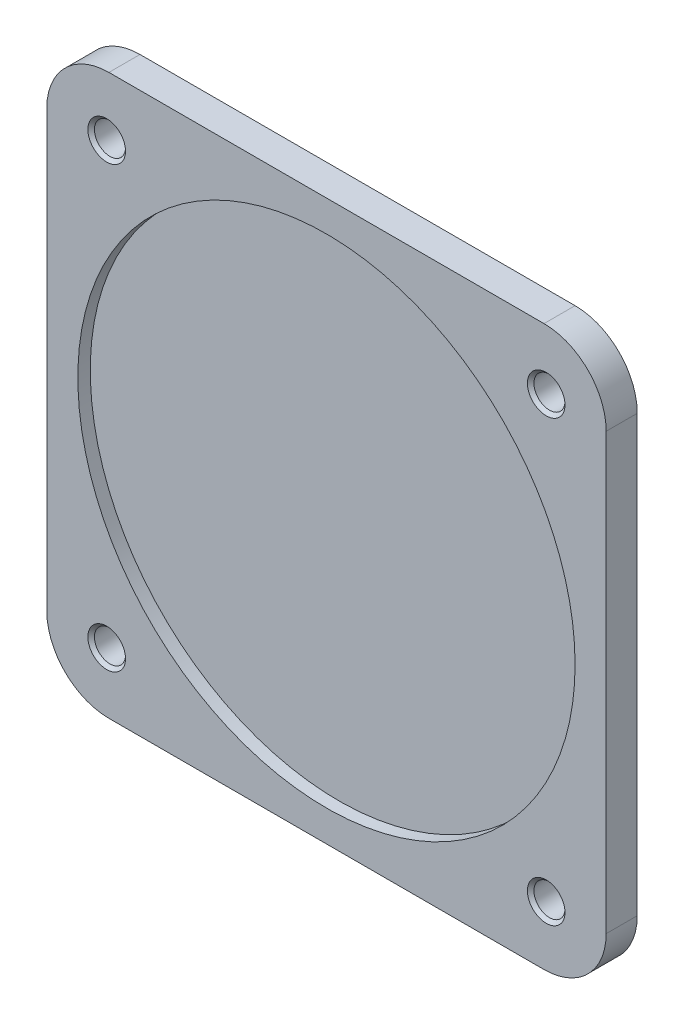
ISO-10303-21;
HEADER;
FILE_DESCRIPTION(('STEP AP214'),'2;1');
FILE_NAME('part.step','',(''),(''),'','','');
FILE_SCHEMA(('AUTOMOTIVE_DESIGN { 1 0 10303 214 1 1 1 1 }'));
ENDSEC;
DATA;
#1=APPLICATION_CONTEXT('core data for automotive mechanical design processes');
#2=APPLICATION_PROTOCOL_DEFINITION('international standard','automotive_design',2000,#1);
#3=PRODUCT_CONTEXT('',#1,'mechanical');
#4=PRODUCT('Part','Part','',(#3));
#5=PRODUCT_RELATED_PRODUCT_CATEGORY('part','',(#4));
#6=PRODUCT_DEFINITION_FORMATION('','',#4);
#7=PRODUCT_DEFINITION_CONTEXT('part definition',#1,'design');
#8=PRODUCT_DEFINITION('design','',#6,#7);
#9=PRODUCT_DEFINITION_SHAPE('','',#8);
#10=(LENGTH_UNIT() NAMED_UNIT(*) SI_UNIT(.MILLI.,.METRE.));
#11=(NAMED_UNIT(*) PLANE_ANGLE_UNIT() SI_UNIT($,.RADIAN.));
#12=(NAMED_UNIT(*) SI_UNIT($,.STERADIAN.) SOLID_ANGLE_UNIT());
#13=UNCERTAINTY_MEASURE_WITH_UNIT(LENGTH_MEASURE(1.E-05),#10,'distance_accuracy_value','');
#14=(GEOMETRIC_REPRESENTATION_CONTEXT(3) GLOBAL_UNCERTAINTY_ASSIGNED_CONTEXT((#13)) GLOBAL_UNIT_ASSIGNED_CONTEXT((#10,
#11,#12)) REPRESENTATION_CONTEXT('',''));
#15=CARTESIAN_POINT('',(0.,0.,0.));
#16=DIRECTION('',(0.,0.,1.));
#17=DIRECTION('',(1.,0.,0.));
#18=AXIS2_PLACEMENT_3D('',#15,#16,#17);
#19=CARTESIAN_POINT('',(45.,45.,5.));
#20=DIRECTION('',(-1.,0.,0.));
#21=DIRECTION('',(0.,-1.,0.));
#22=AXIS2_PLACEMENT_3D('',#19,#20,#21);
#23=PLANE('',#22);
#24=DIRECTION('',(0.,1.,0.));
#25=VECTOR('',#24,1.);
#26=CARTESIAN_POINT('',(45.,45.,5.));
#27=LINE('',#26,#25);
#28=CARTESIAN_POINT('',(45.,-35.,5.));
#29=VERTEX_POINT('',#28);
#30=CARTESIAN_POINT('',(45.,35.,5.));
#31=VERTEX_POINT('',#30);
#32=EDGE_CURVE('E129',#29,#31,#27,.T.);
#33=ORIENTED_EDGE('',*,*,#32,.F.);
#34=DIRECTION('',(0.,0.,-1.));
#35=VECTOR('',#34,1.);
#36=CARTESIAN_POINT('',(45.,-35.,5.));
#37=LINE('',#36,#35);
#38=CARTESIAN_POINT('',(45.,-35.,0.));
#39=VERTEX_POINT('',#38);
#40=EDGE_CURVE('E114',#29,#39,#37,.T.);
#41=ORIENTED_EDGE('',*,*,#40,.T.);
#42=DIRECTION('',(0.,1.,0.));
#43=VECTOR('',#42,1.);
#44=CARTESIAN_POINT('',(45.,45.,0.));
#45=LINE('',#44,#43);
#46=CARTESIAN_POINT('',(45.,35.,0.));
#47=VERTEX_POINT('',#46);
#48=EDGE_CURVE('E126',#39,#47,#45,.T.);
#49=ORIENTED_EDGE('',*,*,#48,.T.);
#50=DIRECTION('',(0.,0.,-1.));
#51=VECTOR('',#50,1.);
#52=CARTESIAN_POINT('',(45.,35.,5.));
#53=LINE('',#52,#51);
#54=EDGE_CURVE('E131',#47,#31,#53,.F.);
#55=ORIENTED_EDGE('',*,*,#54,.T.);
#56=EDGE_LOOP('',(#33,#41,#49,#55));
#57=FACE_BOUND('',#56,.T.);
#58=ADVANCED_FACE('F41',(#57),#23,.F.);
#59=CARTESIAN_POINT('',(-45.,45.,5.));
#60=DIRECTION('',(0.,-1.,0.));
#61=DIRECTION('',(0.,0.,-1.));
#62=AXIS2_PLACEMENT_3D('',#59,#60,#61);
#63=PLANE('',#62);
#64=DIRECTION('',(-1.,0.,0.));
#65=VECTOR('',#64,1.);
#66=CARTESIAN_POINT('',(-45.,45.,5.));
#67=LINE('',#66,#65);
#68=CARTESIAN_POINT('',(35.,45.,5.));
#69=VERTEX_POINT('',#68);
#70=CARTESIAN_POINT('',(-35.,45.,5.));
#71=VERTEX_POINT('',#70);
#72=EDGE_CURVE('E199',#69,#71,#67,.T.);
#73=ORIENTED_EDGE('',*,*,#72,.F.);
#74=DIRECTION('',(0.,0.,-1.));
#75=VECTOR('',#74,1.);
#76=CARTESIAN_POINT('',(35.,45.,5.));
#77=LINE('',#76,#75);
#78=CARTESIAN_POINT('',(35.,45.,0.));
#79=VERTEX_POINT('',#78);
#80=EDGE_CURVE('E11',#69,#79,#77,.T.);
#81=ORIENTED_EDGE('',*,*,#80,.T.);
#82=DIRECTION('',(-1.,0.,0.));
#83=VECTOR('',#82,1.);
#84=CARTESIAN_POINT('',(-45.,45.,0.));
#85=LINE('',#84,#83);
#86=CARTESIAN_POINT('',(-35.,45.,0.));
#87=VERTEX_POINT('',#86);
#88=EDGE_CURVE('E136',#79,#87,#85,.T.);
#89=ORIENTED_EDGE('',*,*,#88,.T.);
#90=DIRECTION('',(0.,0.,-1.));
#91=VECTOR('',#90,1.);
#92=CARTESIAN_POINT('',(-35.,45.,5.));
#93=LINE('',#92,#91);
#94=EDGE_CURVE('E50',#87,#71,#93,.F.);
#95=ORIENTED_EDGE('',*,*,#94,.T.);
#96=EDGE_LOOP('',(#73,#81,#89,#95));
#97=FACE_BOUND('',#96,.T.);
#98=ADVANCED_FACE('F217',(#97),#63,.F.);
#99=CARTESIAN_POINT('',(-45.,45.,5.));
#100=DIRECTION('',(1.,0.,0.));
#101=DIRECTION('',(0.,1.,0.));
#102=AXIS2_PLACEMENT_3D('',#99,#100,#101);
#103=PLANE('',#102);
#104=DIRECTION('',(0.,-1.,0.));
#105=VECTOR('',#104,1.);
#106=CARTESIAN_POINT('',(-45.,45.,0.));
#107=LINE('',#106,#105);
#108=CARTESIAN_POINT('',(-45.,35.,0.));
#109=VERTEX_POINT('',#108);
#110=CARTESIAN_POINT('',(-45.,-35.,0.));
#111=VERTEX_POINT('',#110);
#112=EDGE_CURVE('E140',#109,#111,#107,.T.);
#113=ORIENTED_EDGE('',*,*,#112,.T.);
#114=DIRECTION('',(0.,0.,-1.));
#115=VECTOR('',#114,1.);
#116=CARTESIAN_POINT('',(-45.,-35.,5.));
#117=LINE('',#116,#115);
#118=CARTESIAN_POINT('',(-45.,-35.,5.));
#119=VERTEX_POINT('',#118);
#120=EDGE_CURVE('E58',#111,#119,#117,.F.);
#121=ORIENTED_EDGE('',*,*,#120,.T.);
#122=DIRECTION('',(0.,-1.,0.));
#123=VECTOR('',#122,1.);
#124=CARTESIAN_POINT('',(-45.,45.,5.));
#125=LINE('',#124,#123);
#126=CARTESIAN_POINT('',(-45.,35.,5.));
#127=VERTEX_POINT('',#126);
#128=EDGE_CURVE('E200',#127,#119,#125,.T.);
#129=ORIENTED_EDGE('',*,*,#128,.F.);
#130=DIRECTION('',(0.,0.,-1.));
#131=VECTOR('',#130,1.);
#132=CARTESIAN_POINT('',(-45.,35.,5.));
#133=LINE('',#132,#131);
#134=EDGE_CURVE('E166',#127,#109,#133,.T.);
#135=ORIENTED_EDGE('',*,*,#134,.T.);
#136=EDGE_LOOP('',(#113,#121,#129,#135));
#137=FACE_BOUND('',#136,.T.);
#138=ADVANCED_FACE('F211',(#137),#103,.F.);
#139=CARTESIAN_POINT('',(-45.,-45.,5.));
#140=DIRECTION('',(0.,1.,0.));
#141=DIRECTION('',(0.,0.,1.));
#142=AXIS2_PLACEMENT_3D('',#139,#140,#141);
#143=PLANE('',#142);
#144=DIRECTION('',(1.,0.,0.));
#145=VECTOR('',#144,1.);
#146=CARTESIAN_POINT('',(-45.,-45.,0.));
#147=LINE('',#146,#145);
#148=CARTESIAN_POINT('',(-35.,-45.,0.));
#149=VERTEX_POINT('',#148);
#150=CARTESIAN_POINT('',(35.,-45.,0.));
#151=VERTEX_POINT('',#150);
#152=EDGE_CURVE('E150',#149,#151,#147,.T.);
#153=ORIENTED_EDGE('',*,*,#152,.T.);
#154=DIRECTION('',(0.,0.,-1.));
#155=VECTOR('',#154,1.);
#156=CARTESIAN_POINT('',(35.,-45.,5.));
#157=LINE('',#156,#155);
#158=CARTESIAN_POINT('',(35.,-45.,5.));
#159=VERTEX_POINT('',#158);
#160=EDGE_CURVE('E115',#151,#159,#157,.F.);
#161=ORIENTED_EDGE('',*,*,#160,.T.);
#162=DIRECTION('',(1.,0.,0.));
#163=VECTOR('',#162,1.);
#164=CARTESIAN_POINT('',(-45.,-45.,5.));
#165=LINE('',#164,#163);
#166=CARTESIAN_POINT('',(-35.,-45.,5.));
#167=VERTEX_POINT('',#166);
#168=EDGE_CURVE('E146',#167,#159,#165,.T.);
#169=ORIENTED_EDGE('',*,*,#168,.F.);
#170=DIRECTION('',(0.,0.,-1.));
#171=VECTOR('',#170,1.);
#172=CARTESIAN_POINT('',(-35.,-45.,5.));
#173=LINE('',#172,#171);
#174=EDGE_CURVE('E120',#167,#149,#173,.T.);
#175=ORIENTED_EDGE('',*,*,#174,.T.);
#176=EDGE_LOOP('',(#153,#161,#169,#175));
#177=FACE_BOUND('',#176,.T.);
#178=ADVANCED_FACE('F207',(#177),#143,.F.);
#179=CARTESIAN_POINT('',(0.,0.,5.));
#180=DIRECTION('',(0.,0.,1.));
#181=DIRECTION('',(1.,0.,0.));
#182=AXIS2_PLACEMENT_3D('',#179,#180,#181);
#183=PLANE('',#182);
#184=CARTESIAN_POINT('',(0.,0.,5.));
#185=DIRECTION('',(0.,0.,1.));
#186=DIRECTION('',(1.,0.,0.));
#187=AXIS2_PLACEMENT_3D('',#184,#185,#186);
#188=CIRCLE('',#187,40.);
#189=CARTESIAN_POINT('',(40.,0.,5.));
#190=VERTEX_POINT('',#189);
#191=EDGE_CURVE('E401',#190,#190,#188,.T.);
#192=ORIENTED_EDGE('',*,*,#191,.F.);
#193=EDGE_LOOP('',(#192));
#194=FACE_BOUND('',#193,.T.);
#195=CARTESIAN_POINT('',(-35.3553390593273,35.3553390593274,5.));
#196=DIRECTION('',(0.,0.,1.));
#197=DIRECTION('',(1.,0.,0.));
#198=AXIS2_PLACEMENT_3D('',#195,#196,#197);
#199=CIRCLE('',#198,3.025);
#200=CARTESIAN_POINT('',(-32.3303390593273,35.3553390593274,5.));
#201=VERTEX_POINT('',#200);
#202=EDGE_CURVE('E400',#201,#201,#199,.T.);
#203=ORIENTED_EDGE('',*,*,#202,.F.);
#204=EDGE_LOOP('',(#203));
#205=FACE_BOUND('',#204,.T.);
#206=CARTESIAN_POINT('',(35.3553390593274,35.3553390593274,5.));
#207=DIRECTION('',(0.,0.,1.));
#208=DIRECTION('',(1.,0.,0.));
#209=AXIS2_PLACEMENT_3D('',#206,#207,#208);
#210=CIRCLE('',#209,3.025);
#211=CARTESIAN_POINT('',(38.3803390593274,35.3553390593274,5.));
#212=VERTEX_POINT('',#211);
#213=EDGE_CURVE('E184',#212,#212,#210,.T.);
#214=ORIENTED_EDGE('',*,*,#213,.F.);
#215=EDGE_LOOP('',(#214));
#216=FACE_BOUND('',#215,.T.);
#217=CARTESIAN_POINT('',(-35.3553390593272,-35.3553390593275,5.));
#218=DIRECTION('',(0.,0.,1.));
#219=DIRECTION('',(1.,0.,0.));
#220=AXIS2_PLACEMENT_3D('',#217,#218,#219);
#221=CIRCLE('',#220,3.025);
#222=CARTESIAN_POINT('',(-32.3303390593272,-35.3553390593275,5.));
#223=VERTEX_POINT('',#222);
#224=EDGE_CURVE('E177',#223,#223,#221,.T.);
#225=ORIENTED_EDGE('',*,*,#224,.F.);
#226=EDGE_LOOP('',(#225));
#227=FACE_BOUND('',#226,.T.);
#228=CARTESIAN_POINT('',(35.3553390593274,-35.3553390593274,5.));
#229=DIRECTION('',(0.,0.,1.));
#230=DIRECTION('',(1.,0.,0.));
#231=AXIS2_PLACEMENT_3D('',#228,#229,#230);
#232=CIRCLE('',#231,3.025);
#233=CARTESIAN_POINT('',(38.3803390593274,-35.3553390593274,5.));
#234=VERTEX_POINT('',#233);
#235=EDGE_CURVE('E173',#234,#234,#232,.T.);
#236=ORIENTED_EDGE('',*,*,#235,.F.);
#237=EDGE_LOOP('',(#236));
#238=FACE_BOUND('',#237,.T.);
#239=ORIENTED_EDGE('',*,*,#168,.T.);
#240=CARTESIAN_POINT('',(35.,-35.,5.));
#241=DIRECTION('',(0.,0.,1.));
#242=DIRECTION('',(1.,0.,0.));
#243=AXIS2_PLACEMENT_3D('',#240,#241,#242);
#244=CIRCLE('',#243,10.);
#245=EDGE_CURVE('E164',#159,#29,#244,.T.);
#246=ORIENTED_EDGE('',*,*,#245,.T.);
#247=ORIENTED_EDGE('',*,*,#32,.T.);
#248=CARTESIAN_POINT('',(35.,35.,5.));
#249=DIRECTION('',(0.,0.,1.));
#250=DIRECTION('',(1.,0.,0.));
#251=AXIS2_PLACEMENT_3D('',#248,#249,#250);
#252=CIRCLE('',#251,10.);
#253=EDGE_CURVE('E160',#31,#69,#252,.T.);
#254=ORIENTED_EDGE('',*,*,#253,.T.);
#255=ORIENTED_EDGE('',*,*,#72,.T.);
#256=CARTESIAN_POINT('',(-35.,35.,5.));
#257=DIRECTION('',(0.,0.,1.));
#258=DIRECTION('',(1.,0.,0.));
#259=AXIS2_PLACEMENT_3D('',#256,#257,#258);
#260=CIRCLE('',#259,10.);
#261=EDGE_CURVE('E65',#71,#127,#260,.T.);
#262=ORIENTED_EDGE('',*,*,#261,.T.);
#263=ORIENTED_EDGE('',*,*,#128,.T.);
#264=CARTESIAN_POINT('',(-35.,-35.,5.));
#265=DIRECTION('',(0.,0.,1.));
#266=DIRECTION('',(1.,0.,0.));
#267=AXIS2_PLACEMENT_3D('',#264,#265,#266);
#268=CIRCLE('',#267,10.);
#269=EDGE_CURVE('E162',#119,#167,#268,.T.);
#270=ORIENTED_EDGE('',*,*,#269,.T.);
#271=EDGE_LOOP('',(#239,#246,#247,#254,#255,#262,#263,#270));
#272=FACE_BOUND('',#271,.T.);
#273=ADVANCED_FACE('F204',(#194,#205,#216,#227,#238,#272),#183,.T.);
#274=CARTESIAN_POINT('',(0.,0.,0.));
#275=DIRECTION('',(0.,0.,1.));
#276=DIRECTION('',(1.,0.,0.));
#277=AXIS2_PLACEMENT_3D('',#274,#275,#276);
#278=PLANE('',#277);
#279=CARTESIAN_POINT('',(-35.3553390593273,35.3553390593274,0.));
#280=DIRECTION('',(0.,0.,1.));
#281=DIRECTION('',(1.,0.,0.));
#282=AXIS2_PLACEMENT_3D('',#279,#280,#281);
#283=CIRCLE('',#282,2.49999999999999);
#284=CARTESIAN_POINT('',(-32.8553390593273,35.3553390593274,0.));
#285=VERTEX_POINT('',#284);
#286=EDGE_CURVE('E45',#285,#285,#283,.T.);
#287=ORIENTED_EDGE('',*,*,#286,.T.);
#288=EDGE_LOOP('',(#287));
#289=FACE_BOUND('',#288,.T.);
#290=CARTESIAN_POINT('',(35.3553390593274,35.3553390593274,0.));
#291=DIRECTION('',(0.,0.,1.));
#292=DIRECTION('',(1.,0.,0.));
#293=AXIS2_PLACEMENT_3D('',#290,#291,#292);
#294=CIRCLE('',#293,2.49999999999999);
#295=CARTESIAN_POINT('',(37.8553390593273,35.3553390593274,0.));
#296=VERTEX_POINT('',#295);
#297=EDGE_CURVE('E175',#296,#296,#294,.T.);
#298=ORIENTED_EDGE('',*,*,#297,.T.);
#299=EDGE_LOOP('',(#298));
#300=FACE_BOUND('',#299,.T.);
#301=CARTESIAN_POINT('',(-35.3553390593272,-35.3553390593275,0.));
#302=DIRECTION('',(0.,0.,1.));
#303=DIRECTION('',(1.,0.,0.));
#304=AXIS2_PLACEMENT_3D('',#301,#302,#303);
#305=CIRCLE('',#304,2.49999999999999);
#306=CARTESIAN_POINT('',(-32.8553390593273,-35.3553390593275,0.));
#307=VERTEX_POINT('',#306);
#308=EDGE_CURVE('E171',#307,#307,#305,.T.);
#309=ORIENTED_EDGE('',*,*,#308,.T.);
#310=EDGE_LOOP('',(#309));
#311=FACE_BOUND('',#310,.T.);
#312=CARTESIAN_POINT('',(35.3553390593274,-35.3553390593274,0.));
#313=DIRECTION('',(0.,0.,1.));
#314=DIRECTION('',(1.,0.,0.));
#315=AXIS2_PLACEMENT_3D('',#312,#313,#314);
#316=CIRCLE('',#315,2.49999999999999);
#317=CARTESIAN_POINT('',(37.8553390593274,-35.3553390593274,0.));
#318=VERTEX_POINT('',#317);
#319=EDGE_CURVE('E137',#318,#318,#316,.T.);
#320=ORIENTED_EDGE('',*,*,#319,.T.);
#321=EDGE_LOOP('',(#320));
#322=FACE_BOUND('',#321,.T.);
#323=ORIENTED_EDGE('',*,*,#48,.F.);
#324=CARTESIAN_POINT('',(35.,-35.,0.));
#325=DIRECTION('',(0.,0.,1.));
#326=DIRECTION('',(1.,0.,0.));
#327=AXIS2_PLACEMENT_3D('',#324,#325,#326);
#328=CIRCLE('',#327,10.);
#329=EDGE_CURVE('E110',#39,#151,#328,.F.);
#330=ORIENTED_EDGE('',*,*,#329,.T.);
#331=ORIENTED_EDGE('',*,*,#152,.F.);
#332=CARTESIAN_POINT('',(-35.,-35.,0.));
#333=DIRECTION('',(0.,0.,1.));
#334=DIRECTION('',(1.,0.,0.));
#335=AXIS2_PLACEMENT_3D('',#332,#333,#334);
#336=CIRCLE('',#335,10.);
#337=EDGE_CURVE('E121',#149,#111,#336,.F.);
#338=ORIENTED_EDGE('',*,*,#337,.T.);
#339=ORIENTED_EDGE('',*,*,#112,.F.);
#340=CARTESIAN_POINT('',(-35.,35.,0.));
#341=DIRECTION('',(0.,0.,1.));
#342=DIRECTION('',(1.,0.,0.));
#343=AXIS2_PLACEMENT_3D('',#340,#341,#342);
#344=CIRCLE('',#343,10.);
#345=EDGE_CURVE('E130',#109,#87,#344,.F.);
#346=ORIENTED_EDGE('',*,*,#345,.T.);
#347=ORIENTED_EDGE('',*,*,#88,.F.);
#348=CARTESIAN_POINT('',(35.,35.,0.));
#349=DIRECTION('',(0.,0.,1.));
#350=DIRECTION('',(1.,0.,0.));
#351=AXIS2_PLACEMENT_3D('',#348,#349,#350);
#352=CIRCLE('',#351,10.);
#353=EDGE_CURVE('E135',#79,#47,#352,.F.);
#354=ORIENTED_EDGE('',*,*,#353,.T.);
#355=EDGE_LOOP('',(#323,#330,#331,#338,#339,#346,#347,#354));
#356=FACE_BOUND('',#355,.T.);
#357=ADVANCED_FACE('F133',(#289,#300,#311,#322,#356),#278,.F.);
#358=CARTESIAN_POINT('',(35.,-35.,5.));
#359=DIRECTION('',(0.,0.,-1.));
#360=DIRECTION('',(-1.,0.,0.));
#361=AXIS2_PLACEMENT_3D('',#358,#359,#360);
#362=CYLINDRICAL_SURFACE('',#361,10.);
#363=ORIENTED_EDGE('',*,*,#245,.F.);
#364=ORIENTED_EDGE('',*,*,#160,.F.);
#365=ORIENTED_EDGE('',*,*,#329,.F.);
#366=ORIENTED_EDGE('',*,*,#40,.F.);
#367=EDGE_LOOP('',(#363,#364,#365,#366));
#368=FACE_BOUND('',#367,.T.);
#369=ADVANCED_FACE('F113',(#368),#362,.T.);
#370=CARTESIAN_POINT('',(-35.,-35.,5.));
#371=DIRECTION('',(0.,0.,-1.));
#372=DIRECTION('',(-1.,0.,0.));
#373=AXIS2_PLACEMENT_3D('',#370,#371,#372);
#374=CYLINDRICAL_SURFACE('',#373,10.);
#375=ORIENTED_EDGE('',*,*,#269,.F.);
#376=ORIENTED_EDGE('',*,*,#120,.F.);
#377=ORIENTED_EDGE('',*,*,#337,.F.);
#378=ORIENTED_EDGE('',*,*,#174,.F.);
#379=EDGE_LOOP('',(#375,#376,#377,#378));
#380=FACE_BOUND('',#379,.T.);
#381=ADVANCED_FACE('F209',(#380),#374,.T.);
#382=CARTESIAN_POINT('',(35.,35.,5.));
#383=DIRECTION('',(0.,0.,-1.));
#384=DIRECTION('',(-1.,0.,0.));
#385=AXIS2_PLACEMENT_3D('',#382,#383,#384);
#386=CYLINDRICAL_SURFACE('',#385,10.);
#387=ORIENTED_EDGE('',*,*,#253,.F.);
#388=ORIENTED_EDGE('',*,*,#54,.F.);
#389=ORIENTED_EDGE('',*,*,#353,.F.);
#390=ORIENTED_EDGE('',*,*,#80,.F.);
#391=EDGE_LOOP('',(#387,#388,#389,#390));
#392=FACE_BOUND('',#391,.T.);
#393=ADVANCED_FACE('F221',(#392),#386,.T.);
#394=CARTESIAN_POINT('',(-35.,35.,5.));
#395=DIRECTION('',(0.,0.,-1.));
#396=DIRECTION('',(-1.,0.,0.));
#397=AXIS2_PLACEMENT_3D('',#394,#395,#396);
#398=CYLINDRICAL_SURFACE('',#397,10.);
#399=ORIENTED_EDGE('',*,*,#261,.F.);
#400=ORIENTED_EDGE('',*,*,#94,.F.);
#401=ORIENTED_EDGE('',*,*,#345,.F.);
#402=ORIENTED_EDGE('',*,*,#134,.F.);
#403=EDGE_LOOP('',(#399,#400,#401,#402));
#404=FACE_BOUND('',#403,.T.);
#405=ADVANCED_FACE('F43',(#404),#398,.T.);
#406=CARTESIAN_POINT('',(35.3553390593274,-35.3553390593274,5.));
#407=DIRECTION('',(0.,0.,1.));
#408=DIRECTION('',(1.,0.,0.));
#409=AXIS2_PLACEMENT_3D('',#406,#407,#408);
#410=CYLINDRICAL_SURFACE('',#409,2.49999999999999);
#411=CARTESIAN_POINT('',(35.3553390593274,-35.3553390593274,4.47499999999999));
#412=DIRECTION('',(0.,0.,1.));
#413=DIRECTION('',(1.,0.,0.));
#414=AXIS2_PLACEMENT_3D('',#411,#412,#413);
#415=CIRCLE('',#414,2.49999999999999);
#416=CARTESIAN_POINT('',(37.8553390593274,-35.3553390593274,4.47499999999999));
#417=VERTEX_POINT('',#416);
#418=EDGE_CURVE('E143',#417,#417,#415,.T.);
#419=ORIENTED_EDGE('',*,*,#418,.T.);
#420=EDGE_LOOP('',(#419));
#421=FACE_BOUND('',#420,.T.);
#422=ORIENTED_EDGE('',*,*,#319,.F.);
#423=EDGE_LOOP('',(#422));
#424=FACE_BOUND('',#423,.T.);
#425=ADVANCED_FACE('F227',(#421,#424),#410,.F.);
#426=CARTESIAN_POINT('',(35.3553390593274,-35.3553390593274,5.));
#427=DIRECTION('',(0.,0.,1.));
#428=DIRECTION('',(1.,0.,0.));
#429=AXIS2_PLACEMENT_3D('',#426,#427,#428);
#430=CONICAL_SURFACE('',#429,3.025,0.785398163397447);
#431=ORIENTED_EDGE('',*,*,#418,.F.);
#432=EDGE_LOOP('',(#431));
#433=FACE_BOUND('',#432,.T.);
#434=ORIENTED_EDGE('',*,*,#235,.T.);
#435=EDGE_LOOP('',(#434));
#436=FACE_BOUND('',#435,.T.);
#437=ADVANCED_FACE('F305',(#433,#436),#430,.F.);
#438=CARTESIAN_POINT('',(-35.3553390593272,-35.3553390593275,5.));
#439=DIRECTION('',(0.,0.,1.));
#440=DIRECTION('',(1.,0.,0.));
#441=AXIS2_PLACEMENT_3D('',#438,#439,#440);
#442=CYLINDRICAL_SURFACE('',#441,2.49999999999999);
#443=CARTESIAN_POINT('',(-35.3553390593272,-35.3553390593275,4.47499999999999));
#444=DIRECTION('',(0.,0.,1.));
#445=DIRECTION('',(1.,0.,0.));
#446=AXIS2_PLACEMENT_3D('',#443,#444,#445);
#447=CIRCLE('',#446,2.49999999999999);
#448=CARTESIAN_POINT('',(-32.8553390593273,-35.3553390593275,4.47499999999999));
#449=VERTEX_POINT('',#448);
#450=EDGE_CURVE('E174',#449,#449,#447,.T.);
#451=ORIENTED_EDGE('',*,*,#450,.T.);
#452=EDGE_LOOP('',(#451));
#453=FACE_BOUND('',#452,.T.);
#454=ORIENTED_EDGE('',*,*,#308,.F.);
#455=EDGE_LOOP('',(#454));
#456=FACE_BOUND('',#455,.T.);
#457=ADVANCED_FACE('F314',(#453,#456),#442,.F.);
#458=CARTESIAN_POINT('',(-35.3553390593272,-35.3553390593275,5.));
#459=DIRECTION('',(0.,0.,1.));
#460=DIRECTION('',(1.,0.,0.));
#461=AXIS2_PLACEMENT_3D('',#458,#459,#460);
#462=CONICAL_SURFACE('',#461,3.025,0.785398163397447);
#463=ORIENTED_EDGE('',*,*,#450,.F.);
#464=EDGE_LOOP('',(#463));
#465=FACE_BOUND('',#464,.T.);
#466=ORIENTED_EDGE('',*,*,#224,.T.);
#467=EDGE_LOOP('',(#466));
#468=FACE_BOUND('',#467,.T.);
#469=ADVANCED_FACE('F325',(#465,#468),#462,.F.);
#470=CARTESIAN_POINT('',(35.3553390593274,35.3553390593274,5.));
#471=DIRECTION('',(0.,0.,1.));
#472=DIRECTION('',(1.,0.,0.));
#473=AXIS2_PLACEMENT_3D('',#470,#471,#472);
#474=CYLINDRICAL_SURFACE('',#473,2.49999999999999);
#475=CARTESIAN_POINT('',(35.3553390593274,35.3553390593274,4.47499999999999));
#476=DIRECTION('',(0.,0.,1.));
#477=DIRECTION('',(1.,0.,0.));
#478=AXIS2_PLACEMENT_3D('',#475,#476,#477);
#479=CIRCLE('',#478,2.49999999999999);
#480=CARTESIAN_POINT('',(37.8553390593273,35.3553390593274,4.47499999999999));
#481=VERTEX_POINT('',#480);
#482=EDGE_CURVE('E178',#481,#481,#479,.T.);
#483=ORIENTED_EDGE('',*,*,#482,.T.);
#484=EDGE_LOOP('',(#483));
#485=FACE_BOUND('',#484,.T.);
#486=ORIENTED_EDGE('',*,*,#297,.F.);
#487=EDGE_LOOP('',(#486));
#488=FACE_BOUND('',#487,.T.);
#489=ADVANCED_FACE('F335',(#485,#488),#474,.F.);
#490=CARTESIAN_POINT('',(35.3553390593274,35.3553390593274,5.));
#491=DIRECTION('',(0.,0.,1.));
#492=DIRECTION('',(1.,0.,0.));
#493=AXIS2_PLACEMENT_3D('',#490,#491,#492);
#494=CONICAL_SURFACE('',#493,3.025,0.785398163397447);
#495=ORIENTED_EDGE('',*,*,#482,.F.);
#496=EDGE_LOOP('',(#495));
#497=FACE_BOUND('',#496,.T.);
#498=ORIENTED_EDGE('',*,*,#213,.T.);
#499=EDGE_LOOP('',(#498));
#500=FACE_BOUND('',#499,.T.);
#501=ADVANCED_FACE('F346',(#497,#500),#494,.F.);
#502=CARTESIAN_POINT('',(-35.3553390593273,35.3553390593274,5.));
#503=DIRECTION('',(0.,0.,1.));
#504=DIRECTION('',(1.,0.,0.));
#505=AXIS2_PLACEMENT_3D('',#502,#503,#504);
#506=CYLINDRICAL_SURFACE('',#505,2.49999999999999);
#507=CARTESIAN_POINT('',(-35.3553390593273,35.3553390593274,4.47499999999999));
#508=DIRECTION('',(0.,0.,1.));
#509=DIRECTION('',(1.,0.,0.));
#510=AXIS2_PLACEMENT_3D('',#507,#508,#509);
#511=CIRCLE('',#510,2.49999999999999);
#512=CARTESIAN_POINT('',(-32.8553390593273,35.3553390593274,4.47499999999999));
#513=VERTEX_POINT('',#512);
#514=EDGE_CURVE('E404',#513,#513,#511,.T.);
#515=ORIENTED_EDGE('',*,*,#514,.T.);
#516=EDGE_LOOP('',(#515));
#517=FACE_BOUND('',#516,.T.);
#518=ORIENTED_EDGE('',*,*,#286,.F.);
#519=EDGE_LOOP('',(#518));
#520=FACE_BOUND('',#519,.T.);
#521=ADVANCED_FACE('F355',(#517,#520),#506,.F.);
#522=CARTESIAN_POINT('',(-35.3553390593273,35.3553390593274,5.));
#523=DIRECTION('',(0.,0.,1.));
#524=DIRECTION('',(1.,0.,0.));
#525=AXIS2_PLACEMENT_3D('',#522,#523,#524);
#526=CONICAL_SURFACE('',#525,3.025,0.785398163397447);
#527=ORIENTED_EDGE('',*,*,#514,.F.);
#528=EDGE_LOOP('',(#527));
#529=FACE_BOUND('',#528,.T.);
#530=ORIENTED_EDGE('',*,*,#202,.T.);
#531=EDGE_LOOP('',(#530));
#532=FACE_BOUND('',#531,.T.);
#533=ADVANCED_FACE('F366',(#529,#532),#526,.F.);
#534=CARTESIAN_POINT('',(0.,0.,3.));
#535=DIRECTION('',(0.,0.,1.));
#536=DIRECTION('',(1.,0.,0.));
#537=AXIS2_PLACEMENT_3D('',#534,#535,#536);
#538=CYLINDRICAL_SURFACE('',#537,40.);
#539=CARTESIAN_POINT('',(0.,0.,3.));
#540=DIRECTION('',(0.,0.,1.));
#541=DIRECTION('',(1.,0.,0.));
#542=AXIS2_PLACEMENT_3D('',#539,#540,#541);
#543=CIRCLE('',#542,40.);
#544=CARTESIAN_POINT('',(40.,0.,3.));
#545=VERTEX_POINT('',#544);
#546=EDGE_CURVE('E399',#545,#545,#543,.T.);
#547=ORIENTED_EDGE('',*,*,#546,.F.);
#548=EDGE_LOOP('',(#547));
#549=FACE_BOUND('',#548,.T.);
#550=ORIENTED_EDGE('',*,*,#191,.T.);
#551=EDGE_LOOP('',(#550));
#552=FACE_BOUND('',#551,.T.);
#553=ADVANCED_FACE('F375',(#549,#552),#538,.F.);
#554=CARTESIAN_POINT('',(0.,0.,3.));
#555=DIRECTION('',(0.,0.,1.));
#556=DIRECTION('',(1.,0.,0.));
#557=AXIS2_PLACEMENT_3D('',#554,#555,#556);
#558=PLANE('',#557);
#559=ORIENTED_EDGE('',*,*,#546,.T.);
#560=EDGE_LOOP('',(#559));
#561=FACE_BOUND('',#560,.T.);
#562=ADVANCED_FACE('F384',(#561),#558,.T.);
#563=CLOSED_SHELL('',(#58,#98,#138,#178,#273,#357,#369,#381,#393,#405,#425,#437,#457,#469,#489,
#501,#521,#533,#553,#562));
#564=MANIFOLD_SOLID_BREP('B2',#563);
#565=ADVANCED_BREP_SHAPE_REPRESENTATION('',(#18,#564),#14);
#566=SHAPE_DEFINITION_REPRESENTATION(#9,#565);
ENDSEC;
END-ISO-10303-21;
